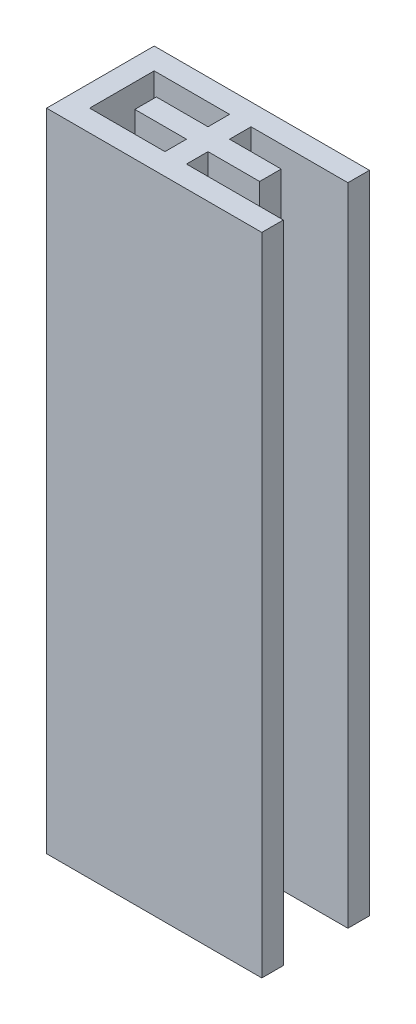
ISO-10303-21;
HEADER;
FILE_DESCRIPTION(('STEP AP214'),'2;1');
FILE_NAME('part.step','',(''),(''),'','','');
FILE_SCHEMA(('AUTOMOTIVE_DESIGN { 1 0 10303 214 1 1 1 1 }'));
ENDSEC;
DATA;
#1=APPLICATION_CONTEXT('core data for automotive mechanical design processes');
#2=APPLICATION_PROTOCOL_DEFINITION('international standard','automotive_design',2000,#1);
#3=PRODUCT_CONTEXT('',#1,'mechanical');
#4=PRODUCT('Part','Part','',(#3));
#5=PRODUCT_RELATED_PRODUCT_CATEGORY('part','',(#4));
#6=PRODUCT_DEFINITION_FORMATION('','',#4);
#7=PRODUCT_DEFINITION_CONTEXT('part definition',#1,'design');
#8=PRODUCT_DEFINITION('design','',#6,#7);
#9=PRODUCT_DEFINITION_SHAPE('','',#8);
#10=(LENGTH_UNIT() NAMED_UNIT(*) SI_UNIT(.MILLI.,.METRE.));
#11=(NAMED_UNIT(*) PLANE_ANGLE_UNIT() SI_UNIT($,.RADIAN.));
#12=(NAMED_UNIT(*) SI_UNIT($,.STERADIAN.) SOLID_ANGLE_UNIT());
#13=UNCERTAINTY_MEASURE_WITH_UNIT(LENGTH_MEASURE(1.E-05),#10,'distance_accuracy_value','');
#14=(GEOMETRIC_REPRESENTATION_CONTEXT(3) GLOBAL_UNCERTAINTY_ASSIGNED_CONTEXT((#13)) GLOBAL_UNIT_ASSIGNED_CONTEXT((#10,
#11,#12)) REPRESENTATION_CONTEXT('',''));
#15=CARTESIAN_POINT('',(0.,0.,0.));
#16=DIRECTION('',(0.,0.,1.));
#17=DIRECTION('',(1.,0.,0.));
#18=AXIS2_PLACEMENT_3D('',#15,#16,#17);
#19=CARTESIAN_POINT('',(-5.00000000000002,300.,0.));
#20=DIRECTION('',(-1.,0.,0.));
#21=DIRECTION('',(0.,0.,1.));
#22=AXIS2_PLACEMENT_3D('',#19,#20,#21);
#23=PLANE('',#22);
#24=DIRECTION('',(0.,0.,-1.));
#25=VECTOR('',#24,1.);
#26=CARTESIAN_POINT('',(-5.00000000000002,0.,0.));
#27=LINE('',#26,#25);
#28=CARTESIAN_POINT('',(-5.00000000000002,0.,-5.));
#29=VERTEX_POINT('',#28);
#30=CARTESIAN_POINT('',(-5.00000000000002,0.,-15.));
#31=VERTEX_POINT('',#30);
#32=EDGE_CURVE('E299',#29,#31,#27,.T.);
#33=ORIENTED_EDGE('',*,*,#32,.F.);
#34=DIRECTION('',(0.,-1.,0.));
#35=VECTOR('',#34,1.);
#36=CARTESIAN_POINT('',(-5.00000000000002,300.,-5.));
#37=LINE('',#36,#35);
#38=CARTESIAN_POINT('',(-5.00000000000002,300.,-5.));
#39=VERTEX_POINT('',#38);
#40=EDGE_CURVE('E11',#39,#29,#37,.T.);
#41=ORIENTED_EDGE('',*,*,#40,.F.);
#42=DIRECTION('',(0.,0.,-1.));
#43=VECTOR('',#42,1.);
#44=CARTESIAN_POINT('',(-5.00000000000002,300.,0.));
#45=LINE('',#44,#43);
#46=CARTESIAN_POINT('',(-5.00000000000002,300.,-15.));
#47=VERTEX_POINT('',#46);
#48=EDGE_CURVE('E214',#39,#47,#45,.T.);
#49=ORIENTED_EDGE('',*,*,#48,.T.);
#50=DIRECTION('',(0.,-1.,0.));
#51=VECTOR('',#50,1.);
#52=CARTESIAN_POINT('',(-5.00000000000002,300.,-15.));
#53=LINE('',#52,#51);
#54=EDGE_CURVE('E127',#47,#31,#53,.T.);
#55=ORIENTED_EDGE('',*,*,#54,.T.);
#56=EDGE_LOOP('',(#33,#41,#49,#55));
#57=FACE_BOUND('',#56,.T.);
#58=ADVANCED_FACE('F37',(#57),#23,.T.);
#59=CARTESIAN_POINT('',(0.,300.,-5.));
#60=DIRECTION('',(0.,0.,-1.));
#61=DIRECTION('',(-1.,0.,0.));
#62=AXIS2_PLACEMENT_3D('',#59,#60,#61);
#63=PLANE('',#62);
#64=DIRECTION('',(1.,0.,0.));
#65=VECTOR('',#64,1.);
#66=CARTESIAN_POINT('',(0.,0.,-5.));
#67=LINE('',#66,#65);
#68=CARTESIAN_POINT('',(-29.,0.,-5.));
#69=VERTEX_POINT('',#68);
#70=EDGE_CURVE('E297',#69,#29,#67,.T.);
#71=ORIENTED_EDGE('',*,*,#70,.F.);
#72=DIRECTION('',(0.,-1.,0.));
#73=VECTOR('',#72,1.);
#74=CARTESIAN_POINT('',(-29.,300.,-5.));
#75=LINE('',#74,#73);
#76=CARTESIAN_POINT('',(-29.,300.,-5.));
#77=VERTEX_POINT('',#76);
#78=EDGE_CURVE('E47',#77,#69,#75,.T.);
#79=ORIENTED_EDGE('',*,*,#78,.F.);
#80=DIRECTION('',(1.,0.,0.));
#81=VECTOR('',#80,1.);
#82=CARTESIAN_POINT('',(0.,300.,-5.));
#83=LINE('',#82,#81);
#84=EDGE_CURVE('E218',#77,#39,#83,.T.);
#85=ORIENTED_EDGE('',*,*,#84,.T.);
#86=ORIENTED_EDGE('',*,*,#40,.T.);
#87=EDGE_LOOP('',(#71,#79,#85,#86));
#88=FACE_BOUND('',#87,.T.);
#89=ADVANCED_FACE('F298',(#88),#63,.T.);
#90=CARTESIAN_POINT('',(-29.,300.,0.));
#91=DIRECTION('',(-1.,0.,0.));
#92=DIRECTION('',(0.,0.,1.));
#93=AXIS2_PLACEMENT_3D('',#90,#91,#92);
#94=PLANE('',#93);
#95=DIRECTION('',(0.,0.,-1.));
#96=VECTOR('',#95,1.);
#97=CARTESIAN_POINT('',(-29.,0.,0.));
#98=LINE('',#97,#96);
#99=CARTESIAN_POINT('',(-29.,0.,5.));
#100=VERTEX_POINT('',#99);
#101=EDGE_CURVE('E290',#100,#69,#98,.T.);
#102=ORIENTED_EDGE('',*,*,#101,.F.);
#103=DIRECTION('',(0.,-1.,0.));
#104=VECTOR('',#103,1.);
#105=CARTESIAN_POINT('',(-29.,300.,5.));
#106=LINE('',#105,#104);
#107=CARTESIAN_POINT('',(-29.,300.,5.));
#108=VERTEX_POINT('',#107);
#109=EDGE_CURVE('E283',#108,#100,#106,.T.);
#110=ORIENTED_EDGE('',*,*,#109,.F.);
#111=DIRECTION('',(0.,0.,-1.));
#112=VECTOR('',#111,1.);
#113=CARTESIAN_POINT('',(-29.,300.,0.));
#114=LINE('',#113,#112);
#115=EDGE_CURVE('E292',#108,#77,#114,.T.);
#116=ORIENTED_EDGE('',*,*,#115,.T.);
#117=ORIENTED_EDGE('',*,*,#78,.T.);
#118=EDGE_LOOP('',(#102,#110,#116,#117));
#119=FACE_BOUND('',#118,.T.);
#120=ADVANCED_FACE('F288',(#119),#94,.T.);
#121=CARTESIAN_POINT('',(0.,300.,5.));
#122=DIRECTION('',(0.,0.,-1.));
#123=DIRECTION('',(-1.,0.,0.));
#124=AXIS2_PLACEMENT_3D('',#121,#122,#123);
#125=PLANE('',#124);
#126=DIRECTION('',(1.,0.,0.));
#127=VECTOR('',#126,1.);
#128=CARTESIAN_POINT('',(0.,0.,5.));
#129=LINE('',#128,#127);
#130=CARTESIAN_POINT('',(-5.00000000000002,0.,5.));
#131=VERTEX_POINT('',#130);
#132=EDGE_CURVE('E305',#100,#131,#129,.T.);
#133=ORIENTED_EDGE('',*,*,#132,.T.);
#134=DIRECTION('',(0.,-1.,0.));
#135=VECTOR('',#134,1.);
#136=CARTESIAN_POINT('',(-5.00000000000002,300.,5.));
#137=LINE('',#136,#135);
#138=CARTESIAN_POINT('',(-5.00000000000002,300.,5.));
#139=VERTEX_POINT('',#138);
#140=EDGE_CURVE('E281',#139,#131,#137,.T.);
#141=ORIENTED_EDGE('',*,*,#140,.F.);
#142=DIRECTION('',(1.,0.,0.));
#143=VECTOR('',#142,1.);
#144=CARTESIAN_POINT('',(0.,300.,5.));
#145=LINE('',#144,#143);
#146=EDGE_CURVE('E209',#108,#139,#145,.T.);
#147=ORIENTED_EDGE('',*,*,#146,.F.);
#148=ORIENTED_EDGE('',*,*,#109,.T.);
#149=EDGE_LOOP('',(#133,#141,#147,#148));
#150=FACE_BOUND('',#149,.T.);
#151=ADVANCED_FACE('F437',(#150),#125,.F.);
#152=CARTESIAN_POINT('',(-5.00000000000002,300.,0.));
#153=DIRECTION('',(-1.,0.,0.));
#154=DIRECTION('',(0.,0.,1.));
#155=AXIS2_PLACEMENT_3D('',#152,#153,#154);
#156=PLANE('',#155);
#157=DIRECTION('',(0.,0.,-1.));
#158=VECTOR('',#157,1.);
#159=CARTESIAN_POINT('',(-5.00000000000002,0.,0.));
#160=LINE('',#159,#158);
#161=CARTESIAN_POINT('',(-5.00000000000001,0.,15.));
#162=VERTEX_POINT('',#161);
#163=EDGE_CURVE('E307',#162,#131,#160,.T.);
#164=ORIENTED_EDGE('',*,*,#163,.F.);
#165=DIRECTION('',(0.,-1.,0.));
#166=VECTOR('',#165,1.);
#167=CARTESIAN_POINT('',(-5.00000000000001,300.,15.));
#168=LINE('',#167,#166);
#169=CARTESIAN_POINT('',(-5.00000000000001,300.,15.));
#170=VERTEX_POINT('',#169);
#171=EDGE_CURVE('E196',#170,#162,#168,.T.);
#172=ORIENTED_EDGE('',*,*,#171,.F.);
#173=DIRECTION('',(0.,0.,-1.));
#174=VECTOR('',#173,1.);
#175=CARTESIAN_POINT('',(-5.00000000000002,300.,0.));
#176=LINE('',#175,#174);
#177=EDGE_CURVE('E206',#170,#139,#176,.T.);
#178=ORIENTED_EDGE('',*,*,#177,.T.);
#179=ORIENTED_EDGE('',*,*,#140,.T.);
#180=EDGE_LOOP('',(#164,#172,#178,#179));
#181=FACE_BOUND('',#180,.T.);
#182=ADVANCED_FACE('F432',(#181),#156,.T.);
#183=CARTESIAN_POINT('',(0.,300.,15.));
#184=DIRECTION('',(0.,0.,-1.));
#185=DIRECTION('',(-1.,0.,0.));
#186=AXIS2_PLACEMENT_3D('',#183,#184,#185);
#187=PLANE('',#186);
#188=DIRECTION('',(1.,0.,0.));
#189=VECTOR('',#188,1.);
#190=CARTESIAN_POINT('',(0.,0.,15.));
#191=LINE('',#190,#189);
#192=CARTESIAN_POINT('',(-40.,0.,15.));
#193=VERTEX_POINT('',#192);
#194=EDGE_CURVE('E193',#193,#162,#191,.T.);
#195=ORIENTED_EDGE('',*,*,#194,.F.);
#196=DIRECTION('',(0.,-1.,0.));
#197=VECTOR('',#196,1.);
#198=CARTESIAN_POINT('',(-40.,300.,15.));
#199=LINE('',#198,#197);
#200=CARTESIAN_POINT('',(-40.,300.,15.));
#201=VERTEX_POINT('',#200);
#202=EDGE_CURVE('E187',#201,#193,#199,.T.);
#203=ORIENTED_EDGE('',*,*,#202,.F.);
#204=DIRECTION('',(1.,0.,0.));
#205=VECTOR('',#204,1.);
#206=CARTESIAN_POINT('',(0.,300.,15.));
#207=LINE('',#206,#205);
#208=EDGE_CURVE('E191',#201,#170,#207,.T.);
#209=ORIENTED_EDGE('',*,*,#208,.T.);
#210=ORIENTED_EDGE('',*,*,#171,.T.);
#211=EDGE_LOOP('',(#195,#203,#209,#210));
#212=FACE_BOUND('',#211,.T.);
#213=ADVANCED_FACE('F189',(#212),#187,.T.);
#214=CARTESIAN_POINT('',(-40.,300.,0.));
#215=DIRECTION('',(-1.,0.,0.));
#216=DIRECTION('',(0.,0.,1.));
#217=AXIS2_PLACEMENT_3D('',#214,#215,#216);
#218=PLANE('',#217);
#219=DIRECTION('',(0.,0.,-1.));
#220=VECTOR('',#219,1.);
#221=CARTESIAN_POINT('',(-40.,0.,0.));
#222=LINE('',#221,#220);
#223=CARTESIAN_POINT('',(-40.,0.,-15.));
#224=VERTEX_POINT('',#223);
#225=EDGE_CURVE('E277',#193,#224,#222,.T.);
#226=ORIENTED_EDGE('',*,*,#225,.T.);
#227=DIRECTION('',(0.,-1.,0.));
#228=VECTOR('',#227,1.);
#229=CARTESIAN_POINT('',(-40.,300.,-15.));
#230=LINE('',#229,#228);
#231=CARTESIAN_POINT('',(-40.,300.,-15.));
#232=VERTEX_POINT('',#231);
#233=EDGE_CURVE('E197',#232,#224,#230,.T.);
#234=ORIENTED_EDGE('',*,*,#233,.F.);
#235=DIRECTION('',(0.,0.,-1.));
#236=VECTOR('',#235,1.);
#237=CARTESIAN_POINT('',(-40.,300.,0.));
#238=LINE('',#237,#236);
#239=EDGE_CURVE('E200',#201,#232,#238,.T.);
#240=ORIENTED_EDGE('',*,*,#239,.F.);
#241=ORIENTED_EDGE('',*,*,#202,.T.);
#242=EDGE_LOOP('',(#226,#234,#240,#241));
#243=FACE_BOUND('',#242,.T.);
#244=ADVANCED_FACE('F201',(#243),#218,.F.);
#245=CARTESIAN_POINT('',(4.99999999999999,300.,0.));
#246=DIRECTION('',(-1.,0.,0.));
#247=DIRECTION('',(0.,0.,1.));
#248=AXIS2_PLACEMENT_3D('',#245,#246,#247);
#249=PLANE('',#248);
#250=DIRECTION('',(0.,0.,-1.));
#251=VECTOR('',#250,1.);
#252=CARTESIAN_POINT('',(4.99999999999999,0.,0.));
#253=LINE('',#252,#251);
#254=CARTESIAN_POINT('',(4.99999999999999,0.,15.));
#255=VERTEX_POINT('',#254);
#256=CARTESIAN_POINT('',(4.99999999999999,0.,5.));
#257=VERTEX_POINT('',#256);
#258=EDGE_CURVE('E362',#255,#257,#253,.T.);
#259=ORIENTED_EDGE('',*,*,#258,.T.);
#260=DIRECTION('',(0.,-1.,0.));
#261=VECTOR('',#260,1.);
#262=CARTESIAN_POINT('',(4.99999999999999,300.,5.));
#263=LINE('',#262,#261);
#264=CARTESIAN_POINT('',(4.99999999999999,300.,5.));
#265=VERTEX_POINT('',#264);
#266=EDGE_CURVE('E41',#265,#257,#263,.T.);
#267=ORIENTED_EDGE('',*,*,#266,.F.);
#268=DIRECTION('',(0.,0.,-1.));
#269=VECTOR('',#268,1.);
#270=CARTESIAN_POINT('',(4.99999999999999,300.,0.));
#271=LINE('',#270,#269);
#272=CARTESIAN_POINT('',(4.99999999999999,300.,15.));
#273=VERTEX_POINT('',#272);
#274=EDGE_CURVE('E338',#273,#265,#271,.T.);
#275=ORIENTED_EDGE('',*,*,#274,.F.);
#276=DIRECTION('',(0.,-1.,0.));
#277=VECTOR('',#276,1.);
#278=CARTESIAN_POINT('',(4.99999999999999,300.,15.));
#279=LINE('',#278,#277);
#280=EDGE_CURVE('E239',#273,#255,#279,.T.);
#281=ORIENTED_EDGE('',*,*,#280,.T.);
#282=EDGE_LOOP('',(#259,#267,#275,#281));
#283=FACE_BOUND('',#282,.T.);
#284=ADVANCED_FACE('F39',(#283),#249,.F.);
#285=CARTESIAN_POINT('',(0.,300.,5.));
#286=DIRECTION('',(0.,0.,-1.));
#287=DIRECTION('',(-1.,0.,0.));
#288=AXIS2_PLACEMENT_3D('',#285,#286,#287);
#289=PLANE('',#288);
#290=DIRECTION('',(1.,0.,0.));
#291=VECTOR('',#290,1.);
#292=CARTESIAN_POINT('',(0.,0.,5.));
#293=LINE('',#292,#291);
#294=CARTESIAN_POINT('',(29.,0.,5.));
#295=VERTEX_POINT('',#294);
#296=EDGE_CURVE('E356',#257,#295,#293,.T.);
#297=ORIENTED_EDGE('',*,*,#296,.T.);
#298=DIRECTION('',(0.,-1.,0.));
#299=VECTOR('',#298,1.);
#300=CARTESIAN_POINT('',(29.,300.,5.));
#301=LINE('',#300,#299);
#302=CARTESIAN_POINT('',(29.,300.,5.));
#303=VERTEX_POINT('',#302);
#304=EDGE_CURVE('E267',#303,#295,#301,.T.);
#305=ORIENTED_EDGE('',*,*,#304,.F.);
#306=DIRECTION('',(1.,0.,0.));
#307=VECTOR('',#306,1.);
#308=CARTESIAN_POINT('',(0.,300.,5.));
#309=LINE('',#308,#307);
#310=EDGE_CURVE('E135',#265,#303,#309,.T.);
#311=ORIENTED_EDGE('',*,*,#310,.F.);
#312=ORIENTED_EDGE('',*,*,#266,.T.);
#313=EDGE_LOOP('',(#297,#305,#311,#312));
#314=FACE_BOUND('',#313,.T.);
#315=ADVANCED_FACE('F399',(#314),#289,.F.);
#316=CARTESIAN_POINT('',(29.,300.,0.));
#317=DIRECTION('',(-1.,0.,0.));
#318=DIRECTION('',(0.,0.,1.));
#319=AXIS2_PLACEMENT_3D('',#316,#317,#318);
#320=PLANE('',#319);
#321=DIRECTION('',(0.,0.,-1.));
#322=VECTOR('',#321,1.);
#323=CARTESIAN_POINT('',(29.,0.,0.));
#324=LINE('',#323,#322);
#325=CARTESIAN_POINT('',(29.,0.,-5.));
#326=VERTEX_POINT('',#325);
#327=EDGE_CURVE('E354',#295,#326,#324,.T.);
#328=ORIENTED_EDGE('',*,*,#327,.T.);
#329=DIRECTION('',(0.,-1.,0.));
#330=VECTOR('',#329,1.);
#331=CARTESIAN_POINT('',(29.,300.,-5.));
#332=LINE('',#331,#330);
#333=CARTESIAN_POINT('',(29.,300.,-5.));
#334=VERTEX_POINT('',#333);
#335=EDGE_CURVE('E266',#334,#326,#332,.T.);
#336=ORIENTED_EDGE('',*,*,#335,.F.);
#337=DIRECTION('',(0.,0.,-1.));
#338=VECTOR('',#337,1.);
#339=CARTESIAN_POINT('',(29.,300.,0.));
#340=LINE('',#339,#338);
#341=EDGE_CURVE('E341',#303,#334,#340,.T.);
#342=ORIENTED_EDGE('',*,*,#341,.F.);
#343=ORIENTED_EDGE('',*,*,#304,.T.);
#344=EDGE_LOOP('',(#328,#336,#342,#343));
#345=FACE_BOUND('',#344,.T.);
#346=ADVANCED_FACE('F353',(#345),#320,.F.);
#347=CARTESIAN_POINT('',(0.,300.,-5.));
#348=DIRECTION('',(0.,0.,-1.));
#349=DIRECTION('',(-1.,0.,0.));
#350=AXIS2_PLACEMENT_3D('',#347,#348,#349);
#351=PLANE('',#350);
#352=DIRECTION('',(1.,0.,0.));
#353=VECTOR('',#352,1.);
#354=CARTESIAN_POINT('',(0.,0.,-5.));
#355=LINE('',#354,#353);
#356=CARTESIAN_POINT('',(4.99999999999999,0.,-5.));
#357=VERTEX_POINT('',#356);
#358=EDGE_CURVE('E336',#357,#326,#355,.T.);
#359=ORIENTED_EDGE('',*,*,#358,.F.);
#360=DIRECTION('',(0.,-1.,0.));
#361=VECTOR('',#360,1.);
#362=CARTESIAN_POINT('',(4.99999999999999,300.,-5.));
#363=LINE('',#362,#361);
#364=CARTESIAN_POINT('',(4.99999999999999,300.,-5.));
#365=VERTEX_POINT('',#364);
#366=EDGE_CURVE('E264',#365,#357,#363,.T.);
#367=ORIENTED_EDGE('',*,*,#366,.F.);
#368=DIRECTION('',(1.,0.,0.));
#369=VECTOR('',#368,1.);
#370=CARTESIAN_POINT('',(0.,300.,-5.));
#371=LINE('',#370,#369);
#372=EDGE_CURVE('E237',#365,#334,#371,.T.);
#373=ORIENTED_EDGE('',*,*,#372,.T.);
#374=ORIENTED_EDGE('',*,*,#335,.T.);
#375=EDGE_LOOP('',(#359,#367,#373,#374));
#376=FACE_BOUND('',#375,.T.);
#377=ADVANCED_FACE('F349',(#376),#351,.T.);
#378=CARTESIAN_POINT('',(4.99999999999999,300.,0.));
#379=DIRECTION('',(-1.,0.,0.));
#380=DIRECTION('',(0.,0.,1.));
#381=AXIS2_PLACEMENT_3D('',#378,#379,#380);
#382=PLANE('',#381);
#383=DIRECTION('',(0.,0.,-1.));
#384=VECTOR('',#383,1.);
#385=CARTESIAN_POINT('',(4.99999999999999,0.,0.));
#386=LINE('',#385,#384);
#387=CARTESIAN_POINT('',(4.99999999999999,0.,-15.));
#388=VERTEX_POINT('',#387);
#389=EDGE_CURVE('E333',#357,#388,#386,.T.);
#390=ORIENTED_EDGE('',*,*,#389,.T.);
#391=DIRECTION('',(0.,-1.,0.));
#392=VECTOR('',#391,1.);
#393=CARTESIAN_POINT('',(4.99999999999999,300.,-15.));
#394=LINE('',#393,#392);
#395=CARTESIAN_POINT('',(4.99999999999999,300.,-15.));
#396=VERTEX_POINT('',#395);
#397=EDGE_CURVE('E261',#396,#388,#394,.T.);
#398=ORIENTED_EDGE('',*,*,#397,.F.);
#399=DIRECTION('',(0.,0.,-1.));
#400=VECTOR('',#399,1.);
#401=CARTESIAN_POINT('',(4.99999999999999,300.,0.));
#402=LINE('',#401,#400);
#403=EDGE_CURVE('E234',#365,#396,#402,.T.);
#404=ORIENTED_EDGE('',*,*,#403,.F.);
#405=ORIENTED_EDGE('',*,*,#366,.T.);
#406=EDGE_LOOP('',(#390,#398,#404,#405));
#407=FACE_BOUND('',#406,.T.);
#408=ADVANCED_FACE('F391',(#407),#382,.F.);
#409=CARTESIAN_POINT('',(0.,300.,-15.));
#410=DIRECTION('',(0.,0.,-1.));
#411=DIRECTION('',(-1.,0.,0.));
#412=AXIS2_PLACEMENT_3D('',#409,#410,#411);
#413=PLANE('',#412);
#414=DIRECTION('',(1.,0.,0.));
#415=VECTOR('',#414,1.);
#416=CARTESIAN_POINT('',(0.,0.,-15.));
#417=LINE('',#416,#415);
#418=CARTESIAN_POINT('',(50.,0.,-15.));
#419=VERTEX_POINT('',#418);
#420=EDGE_CURVE('E329',#388,#419,#417,.T.);
#421=ORIENTED_EDGE('',*,*,#420,.T.);
#422=DIRECTION('',(0.,-1.,0.));
#423=VECTOR('',#422,1.);
#424=CARTESIAN_POINT('',(50.,300.,-15.));
#425=LINE('',#424,#423);
#426=CARTESIAN_POINT('',(50.,300.,-15.));
#427=VERTEX_POINT('',#426);
#428=EDGE_CURVE('E258',#427,#419,#425,.T.);
#429=ORIENTED_EDGE('',*,*,#428,.F.);
#430=DIRECTION('',(1.,0.,0.));
#431=VECTOR('',#430,1.);
#432=CARTESIAN_POINT('',(0.,300.,-15.));
#433=LINE('',#432,#431);
#434=EDGE_CURVE('E229',#396,#427,#433,.T.);
#435=ORIENTED_EDGE('',*,*,#434,.F.);
#436=ORIENTED_EDGE('',*,*,#397,.T.);
#437=EDGE_LOOP('',(#421,#429,#435,#436));
#438=FACE_BOUND('',#437,.T.);
#439=ADVANCED_FACE('F394',(#438),#413,.F.);
#440=CARTESIAN_POINT('',(50.,300.,0.));
#441=DIRECTION('',(-1.,0.,0.));
#442=DIRECTION('',(0.,0.,1.));
#443=AXIS2_PLACEMENT_3D('',#440,#441,#442);
#444=PLANE('',#443);
#445=DIRECTION('',(0.,0.,-1.));
#446=VECTOR('',#445,1.);
#447=CARTESIAN_POINT('',(50.,0.,0.));
#448=LINE('',#447,#446);
#449=CARTESIAN_POINT('',(50.,0.,-25.));
#450=VERTEX_POINT('',#449);
#451=EDGE_CURVE('E322',#419,#450,#448,.T.);
#452=ORIENTED_EDGE('',*,*,#451,.T.);
#453=DIRECTION('',(0.,-1.,0.));
#454=VECTOR('',#453,1.);
#455=CARTESIAN_POINT('',(50.,300.,-25.));
#456=LINE('',#455,#454);
#457=CARTESIAN_POINT('',(50.,300.,-25.));
#458=VERTEX_POINT('',#457);
#459=EDGE_CURVE('E256',#458,#450,#456,.T.);
#460=ORIENTED_EDGE('',*,*,#459,.F.);
#461=DIRECTION('',(0.,0.,-1.));
#462=VECTOR('',#461,1.);
#463=CARTESIAN_POINT('',(50.,300.,0.));
#464=LINE('',#463,#462);
#465=EDGE_CURVE('E221',#427,#458,#464,.T.);
#466=ORIENTED_EDGE('',*,*,#465,.F.);
#467=ORIENTED_EDGE('',*,*,#428,.T.);
#468=EDGE_LOOP('',(#452,#460,#466,#467));
#469=FACE_BOUND('',#468,.T.);
#470=ADVANCED_FACE('F379',(#469),#444,.F.);
#471=CARTESIAN_POINT('',(0.,300.,-25.));
#472=DIRECTION('',(0.,0.,-1.));
#473=DIRECTION('',(-1.,0.,0.));
#474=AXIS2_PLACEMENT_3D('',#471,#472,#473);
#475=PLANE('',#474);
#476=DIRECTION('',(1.,0.,0.));
#477=VECTOR('',#476,1.);
#478=CARTESIAN_POINT('',(0.,0.,-25.));
#479=LINE('',#478,#477);
#480=CARTESIAN_POINT('',(-50.,0.,-25.));
#481=VERTEX_POINT('',#480);
#482=EDGE_CURVE('E328',#481,#450,#479,.T.);
#483=ORIENTED_EDGE('',*,*,#482,.F.);
#484=DIRECTION('',(0.,-1.,0.));
#485=VECTOR('',#484,1.);
#486=CARTESIAN_POINT('',(-50.,300.,-25.));
#487=LINE('',#486,#485);
#488=CARTESIAN_POINT('',(-50.,300.,-25.));
#489=VERTEX_POINT('',#488);
#490=EDGE_CURVE('E254',#489,#481,#487,.T.);
#491=ORIENTED_EDGE('',*,*,#490,.F.);
#492=DIRECTION('',(1.,0.,0.));
#493=VECTOR('',#492,1.);
#494=CARTESIAN_POINT('',(0.,300.,-25.));
#495=LINE('',#494,#493);
#496=EDGE_CURVE('E228',#489,#458,#495,.T.);
#497=ORIENTED_EDGE('',*,*,#496,.T.);
#498=ORIENTED_EDGE('',*,*,#459,.T.);
#499=EDGE_LOOP('',(#483,#491,#497,#498));
#500=FACE_BOUND('',#499,.T.);
#501=ADVANCED_FACE('F386',(#500),#475,.T.);
#502=CARTESIAN_POINT('',(-50.,300.,0.));
#503=DIRECTION('',(-1.,0.,0.));
#504=DIRECTION('',(0.,0.,1.));
#505=AXIS2_PLACEMENT_3D('',#502,#503,#504);
#506=PLANE('',#505);
#507=DIRECTION('',(0.,0.,-1.));
#508=VECTOR('',#507,1.);
#509=CARTESIAN_POINT('',(-50.,0.,0.));
#510=LINE('',#509,#508);
#511=CARTESIAN_POINT('',(-50.,0.,25.));
#512=VERTEX_POINT('',#511);
#513=EDGE_CURVE('E324',#512,#481,#510,.T.);
#514=ORIENTED_EDGE('',*,*,#513,.F.);
#515=DIRECTION('',(0.,-1.,0.));
#516=VECTOR('',#515,1.);
#517=CARTESIAN_POINT('',(-50.,300.,25.));
#518=LINE('',#517,#516);
#519=CARTESIAN_POINT('',(-50.,300.,25.));
#520=VERTEX_POINT('',#519);
#521=EDGE_CURVE('E252',#520,#512,#518,.T.);
#522=ORIENTED_EDGE('',*,*,#521,.F.);
#523=DIRECTION('',(0.,0.,-1.));
#524=VECTOR('',#523,1.);
#525=CARTESIAN_POINT('',(-50.,300.,0.));
#526=LINE('',#525,#524);
#527=EDGE_CURVE('E225',#520,#489,#526,.T.);
#528=ORIENTED_EDGE('',*,*,#527,.T.);
#529=ORIENTED_EDGE('',*,*,#490,.T.);
#530=EDGE_LOOP('',(#514,#522,#528,#529));
#531=FACE_BOUND('',#530,.T.);
#532=ADVANCED_FACE('F382',(#531),#506,.T.);
#533=CARTESIAN_POINT('',(0.,300.,25.));
#534=DIRECTION('',(0.,0.,-1.));
#535=DIRECTION('',(-1.,0.,0.));
#536=AXIS2_PLACEMENT_3D('',#533,#534,#535);
#537=PLANE('',#536);
#538=DIRECTION('',(1.,0.,0.));
#539=VECTOR('',#538,1.);
#540=CARTESIAN_POINT('',(0.,0.,25.));
#541=LINE('',#540,#539);
#542=CARTESIAN_POINT('',(50.,0.,25.));
#543=VERTEX_POINT('',#542);
#544=EDGE_CURVE('E320',#512,#543,#541,.T.);
#545=ORIENTED_EDGE('',*,*,#544,.T.);
#546=DIRECTION('',(0.,-1.,0.));
#547=VECTOR('',#546,1.);
#548=CARTESIAN_POINT('',(50.,300.,25.));
#549=LINE('',#548,#547);
#550=CARTESIAN_POINT('',(50.,300.,25.));
#551=VERTEX_POINT('',#550);
#552=EDGE_CURVE('E246',#551,#543,#549,.T.);
#553=ORIENTED_EDGE('',*,*,#552,.F.);
#554=DIRECTION('',(1.,0.,0.));
#555=VECTOR('',#554,1.);
#556=CARTESIAN_POINT('',(0.,300.,25.));
#557=LINE('',#556,#555);
#558=EDGE_CURVE('E219',#520,#551,#557,.T.);
#559=ORIENTED_EDGE('',*,*,#558,.F.);
#560=ORIENTED_EDGE('',*,*,#521,.T.);
#561=EDGE_LOOP('',(#545,#553,#559,#560));
#562=FACE_BOUND('',#561,.T.);
#563=ADVANCED_FACE('F378',(#562),#537,.F.);
#564=CARTESIAN_POINT('',(50.,0.,15.));
#565=VERTEX_POINT('',#564);
#566=EDGE_CURVE('E315',#543,#565,#448,.T.);
#567=ORIENTED_EDGE('',*,*,#566,.T.);
#568=DIRECTION('',(0.,-1.,0.));
#569=VECTOR('',#568,1.);
#570=CARTESIAN_POINT('',(50.,300.,15.));
#571=LINE('',#570,#569);
#572=CARTESIAN_POINT('',(50.,300.,15.));
#573=VERTEX_POINT('',#572);
#574=EDGE_CURVE('E240',#573,#565,#571,.T.);
#575=ORIENTED_EDGE('',*,*,#574,.F.);
#576=EDGE_CURVE('E215',#551,#573,#464,.T.);
#577=ORIENTED_EDGE('',*,*,#576,.F.);
#578=ORIENTED_EDGE('',*,*,#552,.T.);
#579=EDGE_LOOP('',(#567,#575,#577,#578));
#580=FACE_BOUND('',#579,.T.);
#581=ADVANCED_FACE('F374',(#580),#444,.F.);
#582=EDGE_CURVE('E312',#255,#565,#191,.T.);
#583=ORIENTED_EDGE('',*,*,#582,.F.);
#584=ORIENTED_EDGE('',*,*,#280,.F.);
#585=EDGE_CURVE('E208',#273,#573,#207,.T.);
#586=ORIENTED_EDGE('',*,*,#585,.T.);
#587=ORIENTED_EDGE('',*,*,#574,.T.);
#588=EDGE_LOOP('',(#583,#584,#586,#587));
#589=FACE_BOUND('',#588,.T.);
#590=ADVANCED_FACE('F377',(#589),#187,.T.);
#591=EDGE_CURVE('E120',#224,#31,#417,.T.);
#592=ORIENTED_EDGE('',*,*,#591,.T.);
#593=ORIENTED_EDGE('',*,*,#54,.F.);
#594=EDGE_CURVE('E56',#232,#47,#433,.T.);
#595=ORIENTED_EDGE('',*,*,#594,.F.);
#596=ORIENTED_EDGE('',*,*,#233,.T.);
#597=EDGE_LOOP('',(#592,#593,#595,#596));
#598=FACE_BOUND('',#597,.T.);
#599=ADVANCED_FACE('F415',(#598),#413,.F.);
#600=CARTESIAN_POINT('',(0.,300.,0.));
#601=DIRECTION('',(0.,1.,0.));
#602=DIRECTION('',(0.,0.,1.));
#603=AXIS2_PLACEMENT_3D('',#600,#601,#602);
#604=PLANE('',#603);
#605=ORIENTED_EDGE('',*,*,#274,.T.);
#606=ORIENTED_EDGE('',*,*,#310,.T.);
#607=ORIENTED_EDGE('',*,*,#341,.T.);
#608=ORIENTED_EDGE('',*,*,#372,.F.);
#609=ORIENTED_EDGE('',*,*,#403,.T.);
#610=ORIENTED_EDGE('',*,*,#434,.T.);
#611=ORIENTED_EDGE('',*,*,#465,.T.);
#612=ORIENTED_EDGE('',*,*,#496,.F.);
#613=ORIENTED_EDGE('',*,*,#527,.F.);
#614=ORIENTED_EDGE('',*,*,#558,.T.);
#615=ORIENTED_EDGE('',*,*,#576,.T.);
#616=ORIENTED_EDGE('',*,*,#585,.F.);
#617=EDGE_LOOP('',(#605,#606,#607,#608,#609,#610,#611,#612,#613,#614,#615,#616));
#618=FACE_BOUND('',#617,.T.);
#619=ORIENTED_EDGE('',*,*,#48,.F.);
#620=ORIENTED_EDGE('',*,*,#84,.F.);
#621=ORIENTED_EDGE('',*,*,#115,.F.);
#622=ORIENTED_EDGE('',*,*,#146,.T.);
#623=ORIENTED_EDGE('',*,*,#177,.F.);
#624=ORIENTED_EDGE('',*,*,#208,.F.);
#625=ORIENTED_EDGE('',*,*,#239,.T.);
#626=ORIENTED_EDGE('',*,*,#594,.T.);
#627=EDGE_LOOP('',(#619,#620,#621,#622,#623,#624,#625,#626));
#628=FACE_BOUND('',#627,.T.);
#629=ADVANCED_FACE('F204',(#618,#628),#604,.T.);
#630=CARTESIAN_POINT('',(0.,0.,0.));
#631=DIRECTION('',(0.,1.,0.));
#632=DIRECTION('',(0.,0.,1.));
#633=AXIS2_PLACEMENT_3D('',#630,#631,#632);
#634=PLANE('',#633);
#635=ORIENTED_EDGE('',*,*,#258,.F.);
#636=ORIENTED_EDGE('',*,*,#582,.T.);
#637=ORIENTED_EDGE('',*,*,#566,.F.);
#638=ORIENTED_EDGE('',*,*,#544,.F.);
#639=ORIENTED_EDGE('',*,*,#513,.T.);
#640=ORIENTED_EDGE('',*,*,#482,.T.);
#641=ORIENTED_EDGE('',*,*,#451,.F.);
#642=ORIENTED_EDGE('',*,*,#420,.F.);
#643=ORIENTED_EDGE('',*,*,#389,.F.);
#644=ORIENTED_EDGE('',*,*,#358,.T.);
#645=ORIENTED_EDGE('',*,*,#327,.F.);
#646=ORIENTED_EDGE('',*,*,#296,.F.);
#647=EDGE_LOOP('',(#635,#636,#637,#638,#639,#640,#641,#642,#643,#644,#645,#646));
#648=FACE_BOUND('',#647,.T.);
#649=ORIENTED_EDGE('',*,*,#32,.T.);
#650=ORIENTED_EDGE('',*,*,#591,.F.);
#651=ORIENTED_EDGE('',*,*,#225,.F.);
#652=ORIENTED_EDGE('',*,*,#194,.T.);
#653=ORIENTED_EDGE('',*,*,#163,.T.);
#654=ORIENTED_EDGE('',*,*,#132,.F.);
#655=ORIENTED_EDGE('',*,*,#101,.T.);
#656=ORIENTED_EDGE('',*,*,#70,.T.);
#657=EDGE_LOOP('',(#649,#650,#651,#652,#653,#654,#655,#656));
#658=FACE_BOUND('',#657,.T.);
#659=ADVANCED_FACE('F302',(#648,#658),#634,.F.);
#660=CLOSED_SHELL('',(#58,#89,#120,#151,#182,#213,#244,#284,#315,#346,#377,#408,#439,#470,#501,
#532,#563,#581,#590,#599,#629,#659));
#661=MANIFOLD_SOLID_BREP('B2',#660);
#662=ADVANCED_BREP_SHAPE_REPRESENTATION('',(#18,#661),#14);
#663=SHAPE_DEFINITION_REPRESENTATION(#9,#662);
ENDSEC;
END-ISO-10303-21;
